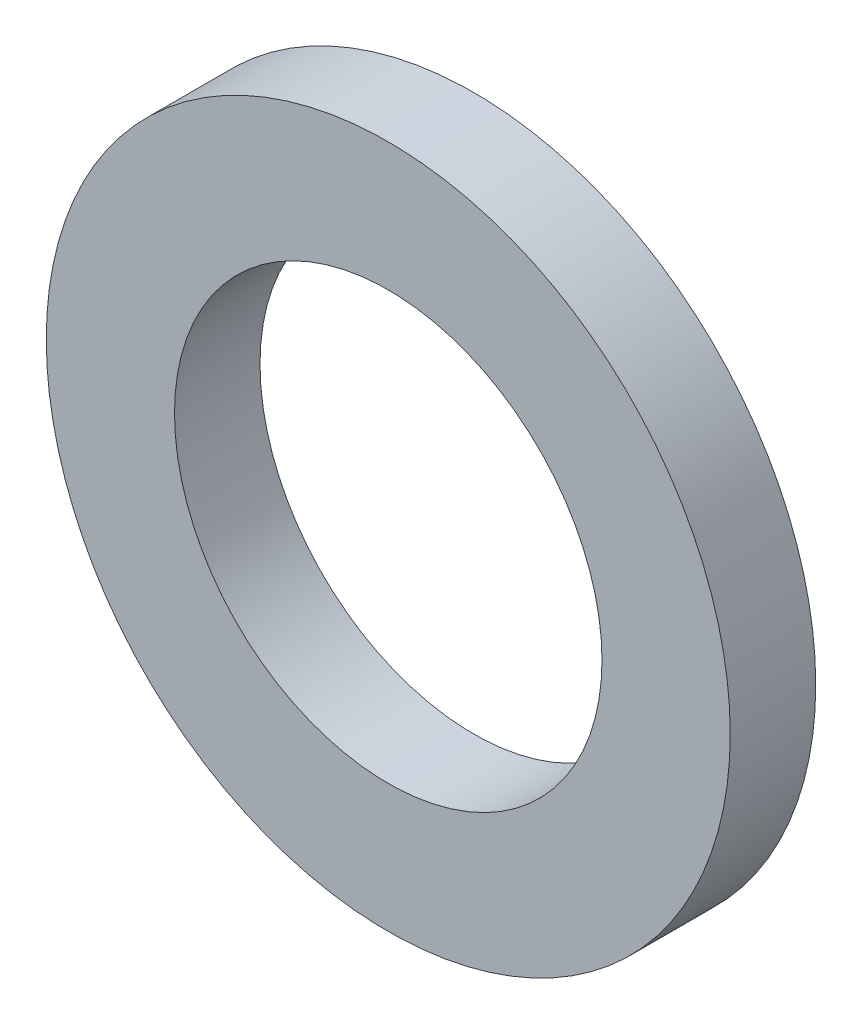
ISO-10303-21;
HEADER;
FILE_DESCRIPTION(('STEP AP214'),'2;1');
FILE_NAME('part.step','',(''),(''),'','','');
FILE_SCHEMA(('AUTOMOTIVE_DESIGN { 1 0 10303 214 1 1 1 1 }'));
ENDSEC;
DATA;
#1=APPLICATION_CONTEXT('core data for automotive mechanical design processes');
#2=APPLICATION_PROTOCOL_DEFINITION('international standard','automotive_design',2000,#1);
#3=PRODUCT_CONTEXT('',#1,'mechanical');
#4=PRODUCT('Part','Part','',(#3));
#5=PRODUCT_RELATED_PRODUCT_CATEGORY('part','',(#4));
#6=PRODUCT_DEFINITION_FORMATION('','',#4);
#7=PRODUCT_DEFINITION_CONTEXT('part definition',#1,'design');
#8=PRODUCT_DEFINITION('design','',#6,#7);
#9=PRODUCT_DEFINITION_SHAPE('','',#8);
#10=(LENGTH_UNIT() NAMED_UNIT(*) SI_UNIT(.MILLI.,.METRE.));
#11=(NAMED_UNIT(*) PLANE_ANGLE_UNIT() SI_UNIT($,.RADIAN.));
#12=(NAMED_UNIT(*) SI_UNIT($,.STERADIAN.) SOLID_ANGLE_UNIT());
#13=UNCERTAINTY_MEASURE_WITH_UNIT(LENGTH_MEASURE(1.E-05),#10,'distance_accuracy_value','');
#14=(GEOMETRIC_REPRESENTATION_CONTEXT(3) GLOBAL_UNCERTAINTY_ASSIGNED_CONTEXT((#13)) GLOBAL_UNIT_ASSIGNED_CONTEXT((#10,
#11,#12)) REPRESENTATION_CONTEXT('',''));
#15=CARTESIAN_POINT('',(0.,0.,0.));
#16=DIRECTION('',(0.,0.,1.));
#17=DIRECTION('',(1.,0.,0.));
#18=AXIS2_PLACEMENT_3D('',#15,#16,#17);
#19=CARTESIAN_POINT('',(0.,0.,1.5875));
#20=DIRECTION('',(0.,0.,-1.));
#21=DIRECTION('',(-1.,0.,0.));
#22=AXIS2_PLACEMENT_3D('',#19,#20,#21);
#23=PLANE('',#22);
#24=CARTESIAN_POINT('',(0.,0.,1.5875));
#25=DIRECTION('',(0.,0.,1.));
#26=DIRECTION('',(1.,0.,0.));
#27=AXIS2_PLACEMENT_3D('',#24,#25,#26);
#28=CIRCLE('',#27,3.96875);
#29=CARTESIAN_POINT('',(3.96875,0.,1.5875));
#30=VERTEX_POINT('',#29);
#31=EDGE_CURVE('E27',#30,#30,#28,.F.);
#32=ORIENTED_EDGE('',*,*,#31,.T.);
#33=EDGE_LOOP('',(#32));
#34=FACE_BOUND('',#33,.T.);
#35=CARTESIAN_POINT('',(0.,0.,1.5875));
#36=DIRECTION('',(0.,0.,1.));
#37=DIRECTION('',(1.,0.,0.));
#38=AXIS2_PLACEMENT_3D('',#35,#36,#37);
#39=CIRCLE('',#38,6.35);
#40=CARTESIAN_POINT('',(6.35,0.,1.5875));
#41=VERTEX_POINT('',#40);
#42=EDGE_CURVE('E18',#41,#41,#39,.F.);
#43=ORIENTED_EDGE('',*,*,#42,.F.);
#44=EDGE_LOOP('',(#43));
#45=FACE_BOUND('',#44,.T.);
#46=ADVANCED_FACE('F15',(#34,#45),#23,.F.);
#47=CARTESIAN_POINT('',(0.,0.,0.));
#48=DIRECTION('',(0.,0.,1.));
#49=DIRECTION('',(1.,0.,0.));
#50=AXIS2_PLACEMENT_3D('',#47,#48,#49);
#51=CYLINDRICAL_SURFACE('',#50,6.35);
#52=CARTESIAN_POINT('',(0.,0.,0.));
#53=DIRECTION('',(0.,0.,1.));
#54=DIRECTION('',(1.,0.,0.));
#55=AXIS2_PLACEMENT_3D('',#52,#53,#54);
#56=CIRCLE('',#55,6.35);
#57=CARTESIAN_POINT('',(6.35,0.,0.));
#58=VERTEX_POINT('',#57);
#59=EDGE_CURVE('E22',#58,#58,#56,.F.);
#60=ORIENTED_EDGE('',*,*,#59,.F.);
#61=EDGE_LOOP('',(#60));
#62=FACE_BOUND('',#61,.T.);
#63=ORIENTED_EDGE('',*,*,#42,.T.);
#64=EDGE_LOOP('',(#63));
#65=FACE_BOUND('',#64,.T.);
#66=ADVANCED_FACE('F35',(#62,#65),#51,.T.);
#67=CARTESIAN_POINT('',(0.,0.,0.));
#68=DIRECTION('',(0.,0.,1.));
#69=DIRECTION('',(1.,0.,0.));
#70=AXIS2_PLACEMENT_3D('',#67,#68,#69);
#71=CYLINDRICAL_SURFACE('',#70,3.96875);
#72=CARTESIAN_POINT('',(0.,0.,0.));
#73=DIRECTION('',(0.,0.,1.));
#74=DIRECTION('',(1.,0.,0.));
#75=AXIS2_PLACEMENT_3D('',#72,#73,#74);
#76=CIRCLE('',#75,3.96875);
#77=CARTESIAN_POINT('',(3.96875,0.,0.));
#78=VERTEX_POINT('',#77);
#79=EDGE_CURVE('E10',#78,#78,#76,.T.);
#80=ORIENTED_EDGE('',*,*,#79,.F.);
#81=EDGE_LOOP('',(#80));
#82=FACE_BOUND('',#81,.T.);
#83=ORIENTED_EDGE('',*,*,#31,.F.);
#84=EDGE_LOOP('',(#83));
#85=FACE_BOUND('',#84,.T.);
#86=ADVANCED_FACE('F42',(#82,#85),#71,.F.);
#87=CARTESIAN_POINT('',(0.,0.,0.));
#88=DIRECTION('',(0.,0.,-1.));
#89=DIRECTION('',(-1.,0.,0.));
#90=AXIS2_PLACEMENT_3D('',#87,#88,#89);
#91=PLANE('',#90);
#92=ORIENTED_EDGE('',*,*,#79,.T.);
#93=EDGE_LOOP('',(#92));
#94=FACE_BOUND('',#93,.T.);
#95=ORIENTED_EDGE('',*,*,#59,.T.);
#96=EDGE_LOOP('',(#95));
#97=FACE_BOUND('',#96,.T.);
#98=ADVANCED_FACE('F44',(#94,#97),#91,.T.);
#99=CLOSED_SHELL('',(#46,#66,#86,#98));
#100=MANIFOLD_SOLID_BREP('B1',#99);
#101=ADVANCED_BREP_SHAPE_REPRESENTATION('',(#18,#100),#14);
#102=SHAPE_DEFINITION_REPRESENTATION(#9,#101);
ENDSEC;
END-ISO-10303-21;
